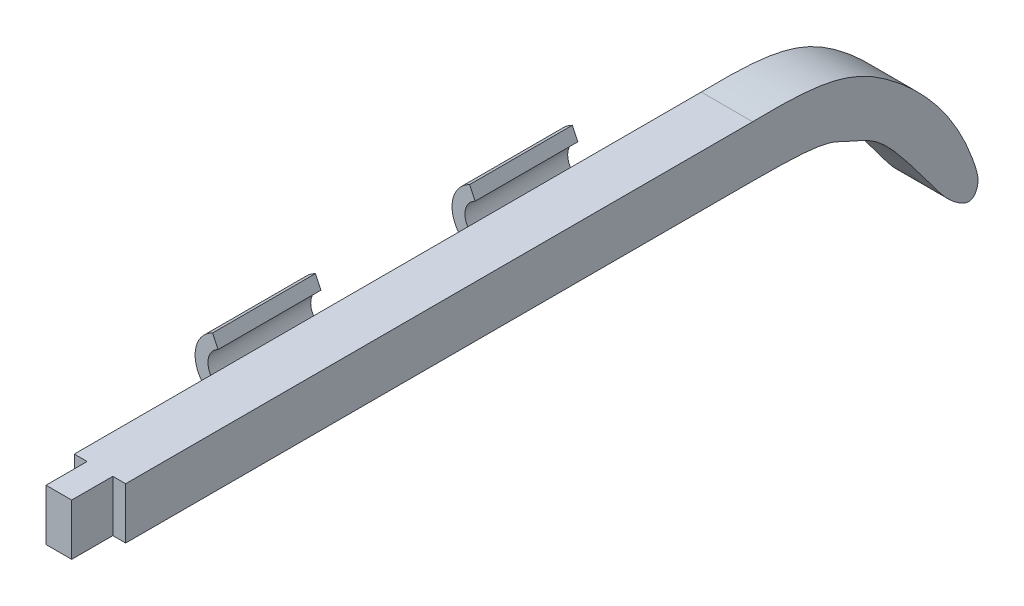
ISO-10303-21;
HEADER;
FILE_DESCRIPTION(('STEP AP214'),'2;1');
FILE_NAME('part.step','',(''),(''),'','','');
FILE_SCHEMA(('AUTOMOTIVE_DESIGN { 1 0 10303 214 1 1 1 1 }'));
ENDSEC;
DATA;
#1=APPLICATION_CONTEXT('core data for automotive mechanical design processes');
#2=APPLICATION_PROTOCOL_DEFINITION('international standard','automotive_design',2000,#1);
#3=PRODUCT_CONTEXT('',#1,'mechanical');
#4=PRODUCT('Part','Part','',(#3));
#5=PRODUCT_RELATED_PRODUCT_CATEGORY('part','',(#4));
#6=PRODUCT_DEFINITION_FORMATION('','',#4);
#7=PRODUCT_DEFINITION_CONTEXT('part definition',#1,'design');
#8=PRODUCT_DEFINITION('design','',#6,#7);
#9=PRODUCT_DEFINITION_SHAPE('','',#8);
#10=(LENGTH_UNIT() NAMED_UNIT(*) SI_UNIT(.MILLI.,.METRE.));
#11=(NAMED_UNIT(*) PLANE_ANGLE_UNIT() SI_UNIT($,.RADIAN.));
#12=(NAMED_UNIT(*) SI_UNIT($,.STERADIAN.) SOLID_ANGLE_UNIT());
#13=UNCERTAINTY_MEASURE_WITH_UNIT(LENGTH_MEASURE(1.E-05),#10,'distance_accuracy_value','');
#14=(GEOMETRIC_REPRESENTATION_CONTEXT(3) GLOBAL_UNCERTAINTY_ASSIGNED_CONTEXT((#13)) GLOBAL_UNIT_ASSIGNED_CONTEXT((#10,
#11,#12)) REPRESENTATION_CONTEXT('',''));
#15=CARTESIAN_POINT('',(0.,0.,0.));
#16=DIRECTION('',(0.,0.,1.));
#17=DIRECTION('',(1.,0.,0.));
#18=AXIS2_PLACEMENT_3D('',#15,#16,#17);
#19=CARTESIAN_POINT('',(0.,-6.42982879689128,-155.300887230622));
#20=DIRECTION('',(1.,0.,0.));
#21=DIRECTION('',(0.,0.,-1.));
#22=AXIS2_PLACEMENT_3D('',#19,#20,#21);
#23=PLANE('',#22);
#24=DIRECTION('',(0.,-1.,0.));
#25=VECTOR('',#24,1.);
#26=CARTESIAN_POINT('',(0.,0.,-90.));
#27=LINE('',#26,#25);
#28=CARTESIAN_POINT('',(0.,4.,-90.));
#29=VERTEX_POINT('',#28);
#30=CARTESIAN_POINT('',(0.,0.999999999999999,-90.));
#31=VERTEX_POINT('',#30);
#32=EDGE_CURVE('E197',#29,#31,#27,.T.);
#33=ORIENTED_EDGE('',*,*,#32,.T.);
#34=DIRECTION('',(0.,0.,-1.));
#35=VECTOR('',#34,1.);
#36=CARTESIAN_POINT('',(0.,0.999999999999999,-90.));
#37=LINE('',#36,#35);
#38=CARTESIAN_POINT('',(0.,0.999999999999999,-110.));
#39=VERTEX_POINT('',#38);
#40=EDGE_CURVE('E219',#31,#39,#37,.T.);
#41=ORIENTED_EDGE('',*,*,#40,.T.);
#42=DIRECTION('',(0.,-1.,0.));
#43=VECTOR('',#42,1.);
#44=CARTESIAN_POINT('',(0.,0.,-110.));
#45=LINE('',#44,#43);
#46=CARTESIAN_POINT('',(0.,4.,-110.));
#47=VERTEX_POINT('',#46);
#48=EDGE_CURVE('E207',#47,#39,#45,.T.);
#49=ORIENTED_EDGE('',*,*,#48,.F.);
#50=DIRECTION('',(0.,0.,-1.));
#51=VECTOR('',#50,1.);
#52=CARTESIAN_POINT('',(0.,4.,-90.));
#53=LINE('',#52,#51);
#54=EDGE_CURVE('E205',#29,#47,#53,.T.);
#55=ORIENTED_EDGE('',*,*,#54,.F.);
#56=EDGE_LOOP('',(#33,#41,#49,#55));
#57=FACE_BOUND('',#56,.T.);
#58=DIRECTION('',(0.,-1.,0.));
#59=VECTOR('',#58,1.);
#60=CARTESIAN_POINT('',(0.,0.,-60.));
#61=LINE('',#60,#59);
#62=CARTESIAN_POINT('',(0.,4.,-60.));
#63=VERTEX_POINT('',#62);
#64=CARTESIAN_POINT('',(0.,0.999999999999999,-60.));
#65=VERTEX_POINT('',#64);
#66=EDGE_CURVE('E233',#63,#65,#61,.T.);
#67=ORIENTED_EDGE('',*,*,#66,.F.);
#68=DIRECTION('',(0.,0.,1.));
#69=VECTOR('',#68,1.);
#70=CARTESIAN_POINT('',(0.,4.,-60.));
#71=LINE('',#70,#69);
#72=CARTESIAN_POINT('',(0.,4.,-40.));
#73=VERTEX_POINT('',#72);
#74=EDGE_CURVE('E245',#63,#73,#71,.T.);
#75=ORIENTED_EDGE('',*,*,#74,.T.);
#76=DIRECTION('',(0.,-1.,0.));
#77=VECTOR('',#76,1.);
#78=CARTESIAN_POINT('',(0.,0.,-40.));
#79=LINE('',#78,#77);
#80=CARTESIAN_POINT('',(0.,0.999999999999999,-40.));
#81=VERTEX_POINT('',#80);
#82=EDGE_CURVE('E227',#73,#81,#79,.T.);
#83=ORIENTED_EDGE('',*,*,#82,.T.);
#84=DIRECTION('',(0.,0.,1.));
#85=VECTOR('',#84,1.);
#86=CARTESIAN_POINT('',(0.,0.999999999999999,-60.));
#87=LINE('',#86,#85);
#88=EDGE_CURVE('E249',#65,#81,#87,.T.);
#89=ORIENTED_EDGE('',*,*,#88,.F.);
#90=EDGE_LOOP('',(#67,#75,#83,#89));
#91=FACE_BOUND('',#90,.T.);
#92=DIRECTION('',(0.,-1.,0.));
#93=VECTOR('',#92,1.);
#94=CARTESIAN_POINT('',(0.,0.,-8.));
#95=LINE('',#94,#93);
#96=CARTESIAN_POINT('',(0.,9.99999999999996,-8.));
#97=VERTEX_POINT('',#96);
#98=CARTESIAN_POINT('',(0.,0.,-8.));
#99=VERTEX_POINT('',#98);
#100=EDGE_CURVE('E184',#97,#99,#95,.T.);
#101=ORIENTED_EDGE('',*,*,#100,.F.);
#102=DIRECTION('',(0.,0.,-1.));
#103=VECTOR('',#102,1.);
#104=CARTESIAN_POINT('',(0.,9.99999999999996,0.));
#105=LINE('',#104,#103);
#106=CARTESIAN_POINT('',(0.,9.99999999999996,-130.));
#107=VERTEX_POINT('',#106);
#108=EDGE_CURVE('E248',#97,#107,#105,.T.);
#109=ORIENTED_EDGE('',*,*,#108,.T.);
#110=CARTESIAN_POINT('',(0.,9.99999999999997,-130.));
#111=CARTESIAN_POINT('',(0.,10.295968590931,-143.257831062412));
#112=CARTESIAN_POINT('',(0.,8.41133936852432,-152.362580677432));
#113=CARTESIAN_POINT('',(0.,-5.77334435383178,-167.478605766022));
#114=CARTESIAN_POINT('',(0.,-16.2820946464498,-172.615930833704));
#115=CARTESIAN_POINT('',(0.,-21.8732348199775,-174.074786886858));
#116=CARTESIAN_POINT('',(0.,-25.2750778877369,-172.857902226209));
#117=CARTESIAN_POINT('',(0.,-23.155195651103,-168.561594529484));
#118=CARTESIAN_POINT('',(0.,-7.44852186325274,-157.06153808889));
#119=CARTESIAN_POINT('',(0.,-5.12655605678584,-154.600537823708));
#120=CARTESIAN_POINT('',(0.,-1.23947524203274,-145.232328072717));
#121=CARTESIAN_POINT('',(0.,0.,-144.477420142203));
#122=CARTESIAN_POINT('',(0.,0.,-130.));
#123=B_SPLINE_CURVE_WITH_KNOTS('',3,(#110,#111,#112,#113,#114,#115,#116,#117,#118,#119,#120,
#121,#122),.UNSPECIFIED.,.F.,.F.,(4,1,1,1,1,1,1,1,1,1,4),(0.,0.101519052300562,
0.157910706506036,0.210541639800686,0.223356201787652,0.228060175251646,0.254301241197406,
0.299209561547706,0.632235058404343,0.706476920960281,1.),.UNSPECIFIED.);
#124=CARTESIAN_POINT('',(0.,0.,-130.));
#125=VERTEX_POINT('',#124);
#126=EDGE_CURVE('E496',#107,#125,#123,.T.);
#127=ORIENTED_EDGE('',*,*,#126,.T.);
#128=DIRECTION('',(0.,0.,1.));
#129=VECTOR('',#128,1.);
#130=CARTESIAN_POINT('',(0.,0.,-130.));
#131=LINE('',#130,#129);
#132=EDGE_CURVE('E258',#125,#99,#131,.T.);
#133=ORIENTED_EDGE('',*,*,#132,.T.);
#134=EDGE_LOOP('',(#101,#109,#127,#133));
#135=FACE_BOUND('',#134,.T.);
#136=ADVANCED_FACE('F39',(#57,#91,#135),#23,.F.);
#137=CARTESIAN_POINT('',(10.,0.,0.));
#138=DIRECTION('',(0.,0.,1.));
#139=DIRECTION('',(1.,0.,0.));
#140=AXIS2_PLACEMENT_3D('',#137,#138,#139);
#141=PLANE('',#140);
#142=DIRECTION('',(0.,-1.,0.));
#143=VECTOR('',#142,1.);
#144=CARTESIAN_POINT('',(7.5,0.,0.));
#145=LINE('',#144,#143);
#146=CARTESIAN_POINT('',(7.5,9.99999999999996,0.));
#147=VERTEX_POINT('',#146);
#148=CARTESIAN_POINT('',(7.5,0.,0.));
#149=VERTEX_POINT('',#148);
#150=EDGE_CURVE('E168',#147,#149,#145,.T.);
#151=ORIENTED_EDGE('',*,*,#150,.F.);
#152=DIRECTION('',(-1.,0.,0.));
#153=VECTOR('',#152,1.);
#154=CARTESIAN_POINT('',(10.,9.99999999999996,0.));
#155=LINE('',#154,#153);
#156=CARTESIAN_POINT('',(2.5,9.99999999999996,0.));
#157=VERTEX_POINT('',#156);
#158=EDGE_CURVE('E43',#147,#157,#155,.T.);
#159=ORIENTED_EDGE('',*,*,#158,.T.);
#160=DIRECTION('',(0.,-1.,0.));
#161=VECTOR('',#160,1.);
#162=CARTESIAN_POINT('',(2.5,0.,0.));
#163=LINE('',#162,#161);
#164=CARTESIAN_POINT('',(2.5,0.,0.));
#165=VERTEX_POINT('',#164);
#166=EDGE_CURVE('E182',#157,#165,#163,.T.);
#167=ORIENTED_EDGE('',*,*,#166,.T.);
#168=DIRECTION('',(-1.,0.,0.));
#169=VECTOR('',#168,1.);
#170=CARTESIAN_POINT('',(10.,0.,0.));
#171=LINE('',#170,#169);
#172=EDGE_CURVE('E11',#149,#165,#171,.T.);
#173=ORIENTED_EDGE('',*,*,#172,.F.);
#174=EDGE_LOOP('',(#151,#159,#167,#173));
#175=FACE_BOUND('',#174,.T.);
#176=ADVANCED_FACE('F41',(#175),#141,.T.);
#177=CARTESIAN_POINT('',(10.,0.,-130.));
#178=DIRECTION('',(0.,-1.,0.));
#179=DIRECTION('',(0.,0.,-1.));
#180=AXIS2_PLACEMENT_3D('',#177,#178,#179);
#181=PLANE('',#180);
#182=DIRECTION('',(0.,0.,1.));
#183=VECTOR('',#182,1.);
#184=CARTESIAN_POINT('',(7.5,0.,-8.));
#185=LINE('',#184,#183);
#186=CARTESIAN_POINT('',(7.5,0.,-8.));
#187=VERTEX_POINT('',#186);
#188=EDGE_CURVE('E160',#187,#149,#185,.T.);
#189=ORIENTED_EDGE('',*,*,#188,.T.);
#190=ORIENTED_EDGE('',*,*,#172,.T.);
#191=DIRECTION('',(0.,0.,1.));
#192=VECTOR('',#191,1.);
#193=CARTESIAN_POINT('',(2.5,0.,-8.));
#194=LINE('',#193,#192);
#195=CARTESIAN_POINT('',(2.5,0.,-8.));
#196=VERTEX_POINT('',#195);
#197=EDGE_CURVE('E191',#196,#165,#194,.T.);
#198=ORIENTED_EDGE('',*,*,#197,.F.);
#199=DIRECTION('',(1.,0.,0.));
#200=VECTOR('',#199,1.);
#201=CARTESIAN_POINT('',(0.,0.,-8.));
#202=LINE('',#201,#200);
#203=EDGE_CURVE('E186',#99,#196,#202,.T.);
#204=ORIENTED_EDGE('',*,*,#203,.F.);
#205=ORIENTED_EDGE('',*,*,#132,.F.);
#206=DIRECTION('',(-1.,0.,0.));
#207=VECTOR('',#206,1.);
#208=CARTESIAN_POINT('',(10.,0.,-130.));
#209=LINE('',#208,#207);
#210=CARTESIAN_POINT('',(10.,0.,-130.));
#211=VERTEX_POINT('',#210);
#212=EDGE_CURVE('E48',#211,#125,#209,.T.);
#213=ORIENTED_EDGE('',*,*,#212,.F.);
#214=DIRECTION('',(0.,0.,1.));
#215=VECTOR('',#214,1.);
#216=CARTESIAN_POINT('',(10.,0.,-130.));
#217=LINE('',#216,#215);
#218=CARTESIAN_POINT('',(10.,0.,-8.00000000000001));
#219=VERTEX_POINT('',#218);
#220=EDGE_CURVE('E264',#211,#219,#217,.T.);
#221=ORIENTED_EDGE('',*,*,#220,.T.);
#222=DIRECTION('',(1.,0.,0.));
#223=VECTOR('',#222,1.);
#224=CARTESIAN_POINT('',(0.,0.,-8.));
#225=LINE('',#224,#223);
#226=EDGE_CURVE('E64',#187,#219,#225,.T.);
#227=ORIENTED_EDGE('',*,*,#226,.F.);
#228=EDGE_LOOP('',(#189,#190,#198,#204,#205,#213,#221,#227));
#229=FACE_BOUND('',#228,.T.);
#230=ADVANCED_FACE('F276',(#229),#181,.T.);
#231=CARTESIAN_POINT('',(10.,9.99999999999996,0.));
#232=DIRECTION('',(0.,1.,0.));
#233=DIRECTION('',(0.,0.,1.));
#234=AXIS2_PLACEMENT_3D('',#231,#232,#233);
#235=PLANE('',#234);
#236=DIRECTION('',(0.,0.,1.));
#237=VECTOR('',#236,1.);
#238=CARTESIAN_POINT('',(7.5,9.99999999999996,-8.));
#239=LINE('',#238,#237);
#240=CARTESIAN_POINT('',(7.5,9.99999999999996,-8.));
#241=VERTEX_POINT('',#240);
#242=EDGE_CURVE('E157',#241,#147,#239,.T.);
#243=ORIENTED_EDGE('',*,*,#242,.F.);
#244=DIRECTION('',(-1.,0.,0.));
#245=VECTOR('',#244,1.);
#246=CARTESIAN_POINT('',(0.,9.99999999999996,-8.));
#247=LINE('',#246,#245);
#248=CARTESIAN_POINT('',(10.,9.99999999999996,-8.));
#249=VERTEX_POINT('',#248);
#250=EDGE_CURVE('E161',#249,#241,#247,.T.);
#251=ORIENTED_EDGE('',*,*,#250,.F.);
#252=DIRECTION('',(0.,0.,-1.));
#253=VECTOR('',#252,1.);
#254=CARTESIAN_POINT('',(10.,9.99999999999996,0.));
#255=LINE('',#254,#253);
#256=CARTESIAN_POINT('',(10.,9.99999999999996,-130.));
#257=VERTEX_POINT('',#256);
#258=EDGE_CURVE('E255',#249,#257,#255,.T.);
#259=ORIENTED_EDGE('',*,*,#258,.T.);
#260=DIRECTION('',(-1.,0.,0.));
#261=VECTOR('',#260,1.);
#262=CARTESIAN_POINT('',(10.,9.99999999999996,-130.));
#263=LINE('',#262,#261);
#264=EDGE_CURVE('E487',#257,#107,#263,.T.);
#265=ORIENTED_EDGE('',*,*,#264,.T.);
#266=ORIENTED_EDGE('',*,*,#108,.F.);
#267=DIRECTION('',(-1.,0.,0.));
#268=VECTOR('',#267,1.);
#269=CARTESIAN_POINT('',(0.,9.99999999999996,-8.));
#270=LINE('',#269,#268);
#271=CARTESIAN_POINT('',(2.5,9.99999999999996,-8.));
#272=VERTEX_POINT('',#271);
#273=EDGE_CURVE('E181',#272,#97,#270,.T.);
#274=ORIENTED_EDGE('',*,*,#273,.F.);
#275=DIRECTION('',(0.,0.,1.));
#276=VECTOR('',#275,1.);
#277=CARTESIAN_POINT('',(2.5,9.99999999999996,-8.));
#278=LINE('',#277,#276);
#279=EDGE_CURVE('E188',#272,#157,#278,.T.);
#280=ORIENTED_EDGE('',*,*,#279,.T.);
#281=ORIENTED_EDGE('',*,*,#158,.F.);
#282=EDGE_LOOP('',(#243,#251,#259,#265,#266,#274,#280,#281));
#283=FACE_BOUND('',#282,.T.);
#284=ADVANCED_FACE('F171',(#283),#235,.T.);
#285=CARTESIAN_POINT('',(10.,-6.42982879689128,-155.300887230622));
#286=DIRECTION('',(1.,0.,0.));
#287=DIRECTION('',(0.,0.,-1.));
#288=AXIS2_PLACEMENT_3D('',#285,#286,#287);
#289=PLANE('',#288);
#290=ORIENTED_EDGE('',*,*,#258,.F.);
#291=DIRECTION('',(0.,1.,0.));
#292=VECTOR('',#291,1.);
#293=CARTESIAN_POINT('',(10.,0.,-8.));
#294=LINE('',#293,#292);
#295=EDGE_CURVE('E165',#219,#249,#294,.T.);
#296=ORIENTED_EDGE('',*,*,#295,.F.);
#297=ORIENTED_EDGE('',*,*,#220,.F.);
#298=CARTESIAN_POINT('',(10.,9.99999999999997,-130.));
#299=CARTESIAN_POINT('',(10.,10.295968590931,-143.257831062412));
#300=CARTESIAN_POINT('',(10.,8.41133936852432,-152.362580677432));
#301=CARTESIAN_POINT('',(10.,-5.77334435383178,-167.478605766022));
#302=CARTESIAN_POINT('',(10.,-16.2820946464498,-172.615930833704));
#303=CARTESIAN_POINT('',(10.,-21.8732348199775,-174.074786886858));
#304=CARTESIAN_POINT('',(10.,-25.2750778877369,-172.857902226209));
#305=CARTESIAN_POINT('',(10.,-23.155195651103,-168.561594529484));
#306=CARTESIAN_POINT('',(10.,-7.44852186325274,-157.06153808889));
#307=CARTESIAN_POINT('',(10.,-5.12655605678584,-154.600537823708));
#308=CARTESIAN_POINT('',(10.,-1.23947524203274,-145.232328072717));
#309=CARTESIAN_POINT('',(10.,0.,-144.477420142203));
#310=CARTESIAN_POINT('',(10.,0.,-130.));
#311=B_SPLINE_CURVE_WITH_KNOTS('',3,(#298,#299,#300,#301,#302,#303,#304,#305,#306,#307,#308,
#309,#310),.UNSPECIFIED.,.F.,.F.,(4,1,1,1,1,1,1,1,1,1,4),(0.,0.101519052300562,
0.157910706506036,0.210541639800686,0.223356201787652,0.228060175251646,0.254301241197406,
0.299209561547706,0.632235058404343,0.706476920960281,1.),.UNSPECIFIED.);
#312=EDGE_CURVE('E257',#257,#211,#311,.T.);
#313=ORIENTED_EDGE('',*,*,#312,.F.);
#314=EDGE_LOOP('',(#290,#296,#297,#313));
#315=FACE_BOUND('',#314,.T.);
#316=ADVANCED_FACE('F274',(#315),#289,.T.);
#317=DIRECTION('',(-1.,0.,0.));
#318=VECTOR('',#317,1.);
#319=SURFACE_OF_LINEAR_EXTRUSION('',#311,#318);
#320=ORIENTED_EDGE('',*,*,#126,.F.);
#321=ORIENTED_EDGE('',*,*,#264,.F.);
#322=ORIENTED_EDGE('',*,*,#312,.T.);
#323=ORIENTED_EDGE('',*,*,#212,.T.);
#324=EDGE_LOOP('',(#320,#321,#322,#323));
#325=FACE_BOUND('',#324,.T.);
#326=ADVANCED_FACE('F270',(#325),#319,.T.);
#327=CARTESIAN_POINT('',(-2.49130432147946,6.45833333333333,-60.));
#328=DIRECTION('',(0.,0.,1.));
#329=DIRECTION('',(1.,0.,0.));
#330=AXIS2_PLACEMENT_3D('',#327,#328,#329);
#331=CYLINDRICAL_SURFACE('',#330,3.5);
#332=CARTESIAN_POINT('',(-2.49130432147946,6.45833333333333,-40.));
#333=DIRECTION('',(0.,0.,1.));
#334=DIRECTION('',(1.,0.,0.));
#335=AXIS2_PLACEMENT_3D('',#332,#333,#334);
#336=CIRCLE('',#335,3.5);
#337=CARTESIAN_POINT('',(-4.,9.61647160605247,-40.));
#338=VERTEX_POINT('',#337);
#339=EDGE_CURVE('E215',#338,#73,#336,.T.);
#340=ORIENTED_EDGE('',*,*,#339,.T.);
#341=ORIENTED_EDGE('',*,*,#74,.F.);
#342=CARTESIAN_POINT('',(-2.49130432147946,6.45833333333333,-60.));
#343=DIRECTION('',(0.,0.,1.));
#344=DIRECTION('',(1.,0.,0.));
#345=AXIS2_PLACEMENT_3D('',#342,#343,#344);
#346=CIRCLE('',#345,3.5);
#347=CARTESIAN_POINT('',(-4.,9.61647160605247,-60.));
#348=VERTEX_POINT('',#347);
#349=EDGE_CURVE('E224',#348,#63,#346,.T.);
#350=ORIENTED_EDGE('',*,*,#349,.F.);
#351=DIRECTION('',(0.,0.,1.));
#352=VECTOR('',#351,1.);
#353=CARTESIAN_POINT('',(-4.,9.61647160605247,-60.));
#354=LINE('',#353,#352);
#355=EDGE_CURVE('E235',#348,#338,#354,.T.);
#356=ORIENTED_EDGE('',*,*,#355,.T.);
#357=EDGE_LOOP('',(#340,#341,#350,#356));
#358=FACE_BOUND('',#357,.T.);
#359=ADVANCED_FACE('F273',(#358),#331,.F.);
#360=CARTESIAN_POINT('',(-2.49130432147946,6.45833333333333,-60.));
#361=DIRECTION('',(0.,0.,1.));
#362=DIRECTION('',(1.,0.,0.));
#363=AXIS2_PLACEMENT_3D('',#360,#361,#362);
#364=CYLINDRICAL_SURFACE('',#363,6.);
#365=CARTESIAN_POINT('',(-2.49130432147946,6.45833333333333,-40.));
#366=DIRECTION('',(0.,0.,1.));
#367=DIRECTION('',(1.,0.,0.));
#368=AXIS2_PLACEMENT_3D('',#365,#366,#367);
#369=CIRCLE('',#368,6.);
#370=CARTESIAN_POINT('',(-5.07763977037182,11.8722846579947,-40.));
#371=VERTEX_POINT('',#370);
#372=EDGE_CURVE('E241',#371,#81,#369,.T.);
#373=ORIENTED_EDGE('',*,*,#372,.F.);
#374=DIRECTION('',(0.,0.,1.));
#375=VECTOR('',#374,1.);
#376=CARTESIAN_POINT('',(-5.07763977037182,11.8722846579947,-60.));
#377=LINE('',#376,#375);
#378=CARTESIAN_POINT('',(-5.07763977037182,11.8722846579947,-60.));
#379=VERTEX_POINT('',#378);
#380=EDGE_CURVE('E252',#379,#371,#377,.T.);
#381=ORIENTED_EDGE('',*,*,#380,.F.);
#382=CARTESIAN_POINT('',(-2.49130432147946,6.45833333333333,-60.));
#383=DIRECTION('',(0.,0.,1.));
#384=DIRECTION('',(1.,0.,0.));
#385=AXIS2_PLACEMENT_3D('',#382,#383,#384);
#386=CIRCLE('',#385,6.);
#387=EDGE_CURVE('E230',#379,#65,#386,.T.);
#388=ORIENTED_EDGE('',*,*,#387,.T.);
#389=ORIENTED_EDGE('',*,*,#88,.T.);
#390=EDGE_LOOP('',(#373,#381,#388,#389));
#391=FACE_BOUND('',#390,.T.);
#392=ADVANCED_FACE('F296',(#391),#364,.T.);
#393=CARTESIAN_POINT('',(0.483588585967888,0.231018387045936,-60.));
#394=DIRECTION('',(0.902325220776897,0.431055908148727,0.));
#395=DIRECTION('',(-0.431055908148727,0.902325220776897,0.));
#396=AXIS2_PLACEMENT_3D('',#393,#394,#395);
#397=PLANE('',#396);
#398=DIRECTION('',(-0.431055908148727,0.902325220776897,0.));
#399=VECTOR('',#398,1.);
#400=CARTESIAN_POINT('',(0.483588585967888,0.231018387045936,-40.));
#401=LINE('',#400,#399);
#402=EDGE_CURVE('E238',#338,#371,#401,.T.);
#403=ORIENTED_EDGE('',*,*,#402,.F.);
#404=ORIENTED_EDGE('',*,*,#355,.F.);
#405=DIRECTION('',(-0.431055908148727,0.902325220776897,0.));
#406=VECTOR('',#405,1.);
#407=CARTESIAN_POINT('',(0.483588585967888,0.231018387045936,-60.));
#408=LINE('',#407,#406);
#409=EDGE_CURVE('E226',#348,#379,#408,.T.);
#410=ORIENTED_EDGE('',*,*,#409,.T.);
#411=ORIENTED_EDGE('',*,*,#380,.T.);
#412=EDGE_LOOP('',(#403,#404,#410,#411));
#413=FACE_BOUND('',#412,.T.);
#414=ADVANCED_FACE('F298',(#413),#397,.T.);
#415=CARTESIAN_POINT('',(0.,0.,-60.));
#416=DIRECTION('',(0.,0.,1.));
#417=DIRECTION('',(1.,0.,0.));
#418=AXIS2_PLACEMENT_3D('',#415,#416,#417);
#419=PLANE('',#418);
#420=ORIENTED_EDGE('',*,*,#349,.T.);
#421=ORIENTED_EDGE('',*,*,#66,.T.);
#422=ORIENTED_EDGE('',*,*,#387,.F.);
#423=ORIENTED_EDGE('',*,*,#409,.F.);
#424=EDGE_LOOP('',(#420,#421,#422,#423));
#425=FACE_BOUND('',#424,.T.);
#426=ADVANCED_FACE('F301',(#425),#419,.F.);
#427=CARTESIAN_POINT('',(0.,0.,-40.));
#428=DIRECTION('',(0.,0.,1.));
#429=DIRECTION('',(1.,0.,0.));
#430=AXIS2_PLACEMENT_3D('',#427,#428,#429);
#431=PLANE('',#430);
#432=ORIENTED_EDGE('',*,*,#339,.F.);
#433=ORIENTED_EDGE('',*,*,#402,.T.);
#434=ORIENTED_EDGE('',*,*,#372,.T.);
#435=ORIENTED_EDGE('',*,*,#82,.F.);
#436=EDGE_LOOP('',(#432,#433,#434,#435));
#437=FACE_BOUND('',#436,.T.);
#438=ADVANCED_FACE('F306',(#437),#431,.T.);
#439=CARTESIAN_POINT('',(-2.49130432147946,6.45833333333333,-90.));
#440=DIRECTION('',(0.,0.,-1.));
#441=DIRECTION('',(-1.,0.,0.));
#442=AXIS2_PLACEMENT_3D('',#439,#440,#441);
#443=CYLINDRICAL_SURFACE('',#442,3.5);
#444=CARTESIAN_POINT('',(-2.49130432147946,6.45833333333333,-110.));
#445=DIRECTION('',(0.,0.,1.));
#446=DIRECTION('',(1.,0.,0.));
#447=AXIS2_PLACEMENT_3D('',#444,#445,#446);
#448=CIRCLE('',#447,3.5);
#449=CARTESIAN_POINT('',(-4.,9.61647160605247,-110.));
#450=VERTEX_POINT('',#449);
#451=EDGE_CURVE('E175',#450,#47,#448,.T.);
#452=ORIENTED_EDGE('',*,*,#451,.F.);
#453=DIRECTION('',(0.,0.,-1.));
#454=VECTOR('',#453,1.);
#455=CARTESIAN_POINT('',(-4.,9.61647160605247,-90.));
#456=LINE('',#455,#454);
#457=CARTESIAN_POINT('',(-4.,9.61647160605247,-90.));
#458=VERTEX_POINT('',#457);
#459=EDGE_CURVE('E213',#458,#450,#456,.T.);
#460=ORIENTED_EDGE('',*,*,#459,.F.);
#461=CARTESIAN_POINT('',(-2.49130432147946,6.45833333333333,-90.));
#462=DIRECTION('',(0.,0.,1.));
#463=DIRECTION('',(1.,0.,0.));
#464=AXIS2_PLACEMENT_3D('',#461,#462,#463);
#465=CIRCLE('',#464,3.5);
#466=EDGE_CURVE('E194',#458,#29,#465,.T.);
#467=ORIENTED_EDGE('',*,*,#466,.T.);
#468=ORIENTED_EDGE('',*,*,#54,.T.);
#469=EDGE_LOOP('',(#452,#460,#467,#468));
#470=FACE_BOUND('',#469,.T.);
#471=ADVANCED_FACE('F309',(#470),#443,.F.);
#472=CARTESIAN_POINT('',(0.483588585967888,0.231018387045936,-90.));
#473=DIRECTION('',(-0.902325220776897,-0.431055908148727,0.));
#474=DIRECTION('',(0.431055908148727,-0.902325220776897,0.));
#475=AXIS2_PLACEMENT_3D('',#472,#473,#474);
#476=PLANE('',#475);
#477=DIRECTION('',(-0.431055908148727,0.902325220776897,0.));
#478=VECTOR('',#477,1.);
#479=CARTESIAN_POINT('',(0.483588585967888,0.231018387045936,-110.));
#480=LINE('',#479,#478);
#481=CARTESIAN_POINT('',(-5.07763977037182,11.8722846579947,-110.));
#482=VERTEX_POINT('',#481);
#483=EDGE_CURVE('E198',#450,#482,#480,.T.);
#484=ORIENTED_EDGE('',*,*,#483,.T.);
#485=DIRECTION('',(0.,0.,-1.));
#486=VECTOR('',#485,1.);
#487=CARTESIAN_POINT('',(-5.07763977037182,11.8722846579947,-90.));
#488=LINE('',#487,#486);
#489=CARTESIAN_POINT('',(-5.07763977037182,11.8722846579947,-90.));
#490=VERTEX_POINT('',#489);
#491=EDGE_CURVE('E216',#490,#482,#488,.T.);
#492=ORIENTED_EDGE('',*,*,#491,.F.);
#493=DIRECTION('',(-0.431055908148727,0.902325220776897,0.));
#494=VECTOR('',#493,1.);
#495=CARTESIAN_POINT('',(0.483588585967888,0.231018387045936,-90.));
#496=LINE('',#495,#494);
#497=EDGE_CURVE('E203',#458,#490,#496,.T.);
#498=ORIENTED_EDGE('',*,*,#497,.F.);
#499=ORIENTED_EDGE('',*,*,#459,.T.);
#500=EDGE_LOOP('',(#484,#492,#498,#499));
#501=FACE_BOUND('',#500,.T.);
#502=ADVANCED_FACE('F316',(#501),#476,.F.);
#503=CARTESIAN_POINT('',(-2.49130432147946,6.45833333333333,-90.));
#504=DIRECTION('',(0.,0.,-1.));
#505=DIRECTION('',(-1.,0.,0.));
#506=AXIS2_PLACEMENT_3D('',#503,#504,#505);
#507=CYLINDRICAL_SURFACE('',#506,6.);
#508=CARTESIAN_POINT('',(-2.49130432147946,6.45833333333333,-110.));
#509=DIRECTION('',(0.,0.,1.));
#510=DIRECTION('',(1.,0.,0.));
#511=AXIS2_PLACEMENT_3D('',#508,#509,#510);
#512=CIRCLE('',#511,6.);
#513=EDGE_CURVE('E210',#482,#39,#512,.T.);
#514=ORIENTED_EDGE('',*,*,#513,.T.);
#515=ORIENTED_EDGE('',*,*,#40,.F.);
#516=CARTESIAN_POINT('',(-2.49130432147946,6.45833333333333,-90.));
#517=DIRECTION('',(0.,0.,1.));
#518=DIRECTION('',(1.,0.,0.));
#519=AXIS2_PLACEMENT_3D('',#516,#517,#518);
#520=CIRCLE('',#519,6.);
#521=EDGE_CURVE('E201',#490,#31,#520,.T.);
#522=ORIENTED_EDGE('',*,*,#521,.F.);
#523=ORIENTED_EDGE('',*,*,#491,.T.);
#524=EDGE_LOOP('',(#514,#515,#522,#523));
#525=FACE_BOUND('',#524,.T.);
#526=ADVANCED_FACE('F318',(#525),#507,.T.);
#527=CARTESIAN_POINT('',(0.,0.,-90.));
#528=DIRECTION('',(0.,0.,-1.));
#529=DIRECTION('',(1.,0.,0.));
#530=AXIS2_PLACEMENT_3D('',#527,#528,#529);
#531=PLANE('',#530);
#532=ORIENTED_EDGE('',*,*,#466,.F.);
#533=ORIENTED_EDGE('',*,*,#497,.T.);
#534=ORIENTED_EDGE('',*,*,#521,.T.);
#535=ORIENTED_EDGE('',*,*,#32,.F.);
#536=EDGE_LOOP('',(#532,#533,#534,#535));
#537=FACE_BOUND('',#536,.T.);
#538=ADVANCED_FACE('F321',(#537),#531,.F.);
#539=CARTESIAN_POINT('',(0.,0.,-110.));
#540=DIRECTION('',(0.,0.,-1.));
#541=DIRECTION('',(1.,0.,0.));
#542=AXIS2_PLACEMENT_3D('',#539,#540,#541);
#543=PLANE('',#542);
#544=ORIENTED_EDGE('',*,*,#451,.T.);
#545=ORIENTED_EDGE('',*,*,#48,.T.);
#546=ORIENTED_EDGE('',*,*,#513,.F.);
#547=ORIENTED_EDGE('',*,*,#483,.F.);
#548=EDGE_LOOP('',(#544,#545,#546,#547));
#549=FACE_BOUND('',#548,.T.);
#550=ADVANCED_FACE('F326',(#549),#543,.T.);
#551=CARTESIAN_POINT('',(7.5,0.,-8.));
#552=DIRECTION('',(-1.,0.,0.));
#553=DIRECTION('',(0.,-1.,0.));
#554=AXIS2_PLACEMENT_3D('',#551,#552,#553);
#555=PLANE('',#554);
#556=ORIENTED_EDGE('',*,*,#150,.T.);
#557=ORIENTED_EDGE('',*,*,#188,.F.);
#558=DIRECTION('',(0.,-1.,0.));
#559=VECTOR('',#558,1.);
#560=CARTESIAN_POINT('',(7.5,0.,-8.));
#561=LINE('',#560,#559);
#562=EDGE_CURVE('E153',#241,#187,#561,.T.);
#563=ORIENTED_EDGE('',*,*,#562,.F.);
#564=ORIENTED_EDGE('',*,*,#242,.T.);
#565=EDGE_LOOP('',(#556,#557,#563,#564));
#566=FACE_BOUND('',#565,.T.);
#567=ADVANCED_FACE('F155',(#566),#555,.F.);
#568=CARTESIAN_POINT('',(0.,0.,-8.));
#569=DIRECTION('',(0.,0.,1.));
#570=DIRECTION('',(1.,0.,0.));
#571=AXIS2_PLACEMENT_3D('',#568,#569,#570);
#572=PLANE('',#571);
#573=ORIENTED_EDGE('',*,*,#250,.T.);
#574=ORIENTED_EDGE('',*,*,#562,.T.);
#575=ORIENTED_EDGE('',*,*,#226,.T.);
#576=ORIENTED_EDGE('',*,*,#295,.T.);
#577=EDGE_LOOP('',(#573,#574,#575,#576));
#578=FACE_BOUND('',#577,.T.);
#579=ADVANCED_FACE('F164',(#578),#572,.T.);
#580=CARTESIAN_POINT('',(2.5,0.,-8.));
#581=DIRECTION('',(-1.,0.,0.));
#582=DIRECTION('',(0.,-1.,0.));
#583=AXIS2_PLACEMENT_3D('',#580,#581,#582);
#584=PLANE('',#583);
#585=ORIENTED_EDGE('',*,*,#166,.F.);
#586=ORIENTED_EDGE('',*,*,#279,.F.);
#587=DIRECTION('',(0.,-1.,0.));
#588=VECTOR('',#587,1.);
#589=CARTESIAN_POINT('',(2.5,0.,-8.));
#590=LINE('',#589,#588);
#591=EDGE_CURVE('E56',#272,#196,#590,.T.);
#592=ORIENTED_EDGE('',*,*,#591,.T.);
#593=ORIENTED_EDGE('',*,*,#197,.T.);
#594=EDGE_LOOP('',(#585,#586,#592,#593));
#595=FACE_BOUND('',#594,.T.);
#596=ADVANCED_FACE('F333',(#595),#584,.T.);
#597=CARTESIAN_POINT('',(0.,0.,-8.));
#598=DIRECTION('',(0.,0.,1.));
#599=DIRECTION('',(1.,0.,0.));
#600=AXIS2_PLACEMENT_3D('',#597,#598,#599);
#601=PLANE('',#600);
#602=ORIENTED_EDGE('',*,*,#591,.F.);
#603=ORIENTED_EDGE('',*,*,#273,.T.);
#604=ORIENTED_EDGE('',*,*,#100,.T.);
#605=ORIENTED_EDGE('',*,*,#203,.T.);
#606=EDGE_LOOP('',(#602,#603,#604,#605));
#607=FACE_BOUND('',#606,.T.);
#608=ADVANCED_FACE('F336',(#607),#601,.T.);
#609=CLOSED_SHELL('',(#136,#176,#230,#284,#316,#326,#359,#392,#414,#426,#438,#471,#502,#526,
#538,#550,#567,#579,#596,#608));
#610=MANIFOLD_SOLID_BREP('B2',#609);
#611=ADVANCED_BREP_SHAPE_REPRESENTATION('',(#18,#610),#14);
#612=SHAPE_DEFINITION_REPRESENTATION(#9,#611);
ENDSEC;
END-ISO-10303-21;
